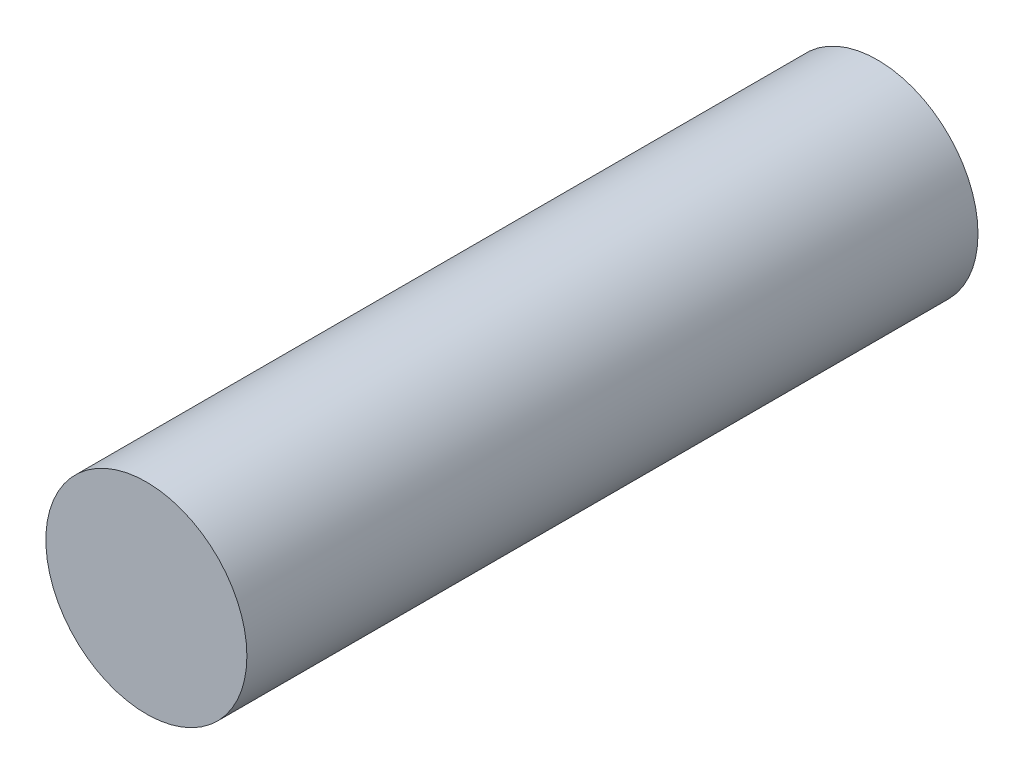
ISO-10303-21;
HEADER;
FILE_DESCRIPTION(('STEP AP214'),'2;1');
FILE_NAME('part.step','',(''),(''),'','','');
FILE_SCHEMA(('AUTOMOTIVE_DESIGN { 1 0 10303 214 1 1 1 1 }'));
ENDSEC;
DATA;
#1=APPLICATION_CONTEXT('core data for automotive mechanical design processes');
#2=APPLICATION_PROTOCOL_DEFINITION('international standard','automotive_design',2000,#1);
#3=PRODUCT_CONTEXT('',#1,'mechanical');
#4=PRODUCT('Part','Part','',(#3));
#5=PRODUCT_RELATED_PRODUCT_CATEGORY('part','',(#4));
#6=PRODUCT_DEFINITION_FORMATION('','',#4);
#7=PRODUCT_DEFINITION_CONTEXT('part definition',#1,'design');
#8=PRODUCT_DEFINITION('design','',#6,#7);
#9=PRODUCT_DEFINITION_SHAPE('','',#8);
#10=(LENGTH_UNIT() NAMED_UNIT(*) SI_UNIT(.MILLI.,.METRE.));
#11=(NAMED_UNIT(*) PLANE_ANGLE_UNIT() SI_UNIT($,.RADIAN.));
#12=(NAMED_UNIT(*) SI_UNIT($,.STERADIAN.) SOLID_ANGLE_UNIT());
#13=UNCERTAINTY_MEASURE_WITH_UNIT(LENGTH_MEASURE(1.E-05),#10,'distance_accuracy_value','');
#14=(GEOMETRIC_REPRESENTATION_CONTEXT(3) GLOBAL_UNCERTAINTY_ASSIGNED_CONTEXT((#13)) GLOBAL_UNIT_ASSIGNED_CONTEXT((#10,
#11,#12)) REPRESENTATION_CONTEXT('',''));
#15=CARTESIAN_POINT('',(0.,0.,0.));
#16=DIRECTION('',(0.,0.,1.));
#17=DIRECTION('',(1.,0.,0.));
#18=AXIS2_PLACEMENT_3D('',#15,#16,#17);
#19=CARTESIAN_POINT('',(0.,0.,40.));
#20=DIRECTION('',(0.,0.,-1.));
#21=DIRECTION('',(-1.,0.,0.));
#22=AXIS2_PLACEMENT_3D('',#19,#20,#21);
#23=CYLINDRICAL_SURFACE('',#22,5.5);
#24=CARTESIAN_POINT('',(0.,0.,40.));
#25=DIRECTION('',(0.,0.,1.));
#26=DIRECTION('',(1.,0.,0.));
#27=AXIS2_PLACEMENT_3D('',#24,#25,#26);
#28=CIRCLE('',#27,5.5);
#29=CARTESIAN_POINT('',(5.5,0.,40.));
#30=VERTEX_POINT('',#29);
#31=EDGE_CURVE('E12',#30,#30,#28,.T.);
#32=ORIENTED_EDGE('',*,*,#31,.F.);
#33=EDGE_LOOP('',(#32));
#34=FACE_BOUND('',#33,.T.);
#35=CARTESIAN_POINT('',(0.,0.,0.));
#36=DIRECTION('',(0.,0.,1.));
#37=DIRECTION('',(1.,0.,0.));
#38=AXIS2_PLACEMENT_3D('',#35,#36,#37);
#39=CIRCLE('',#38,5.5);
#40=CARTESIAN_POINT('',(5.5,0.,0.));
#41=VERTEX_POINT('',#40);
#42=EDGE_CURVE('E43',#41,#41,#39,.T.);
#43=ORIENTED_EDGE('',*,*,#42,.T.);
#44=EDGE_LOOP('',(#43));
#45=FACE_BOUND('',#44,.T.);
#46=ADVANCED_FACE('F40',(#34,#45),#23,.T.);
#47=CARTESIAN_POINT('',(0.,0.,40.));
#48=DIRECTION('',(0.,0.,1.));
#49=DIRECTION('',(1.,0.,0.));
#50=AXIS2_PLACEMENT_3D('',#47,#48,#49);
#51=PLANE('',#50);
#52=ORIENTED_EDGE('',*,*,#31,.T.);
#53=EDGE_LOOP('',(#52));
#54=FACE_BOUND('',#53,.T.);
#55=ADVANCED_FACE('F55',(#54),#51,.T.);
#56=CARTESIAN_POINT('',(0.,0.,0.));
#57=DIRECTION('',(0.,0.,1.));
#58=DIRECTION('',(1.,0.,0.));
#59=AXIS2_PLACEMENT_3D('',#56,#57,#58);
#60=PLANE('',#59);
#61=ORIENTED_EDGE('',*,*,#42,.F.);
#62=EDGE_LOOP('',(#61));
#63=FACE_BOUND('',#62,.T.);
#64=ADVANCED_FACE('F53',(#63),#60,.F.);
#65=CLOSED_SHELL('',(#46,#55,#64));
#66=MANIFOLD_SOLID_BREP('B2',#65);
#67=ADVANCED_BREP_SHAPE_REPRESENTATION('',(#18,#66),#14);
#68=SHAPE_DEFINITION_REPRESENTATION(#9,#67);
ENDSEC;
END-ISO-10303-21;
